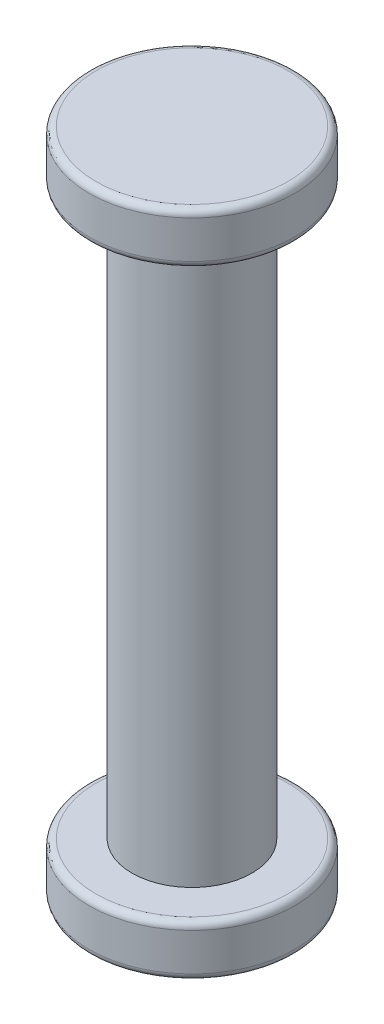
ISO-10303-21;
HEADER;
FILE_DESCRIPTION(('STEP AP214'),'2;1');
FILE_NAME('part.step','',(''),(''),'','','');
FILE_SCHEMA(('AUTOMOTIVE_DESIGN { 1 0 10303 214 1 1 1 1 }'));
ENDSEC;
DATA;
#1=APPLICATION_CONTEXT('core data for automotive mechanical design processes');
#2=APPLICATION_PROTOCOL_DEFINITION('international standard','automotive_design',2000,#1);
#3=PRODUCT_CONTEXT('',#1,'mechanical');
#4=PRODUCT('Part','Part','',(#3));
#5=PRODUCT_RELATED_PRODUCT_CATEGORY('part','',(#4));
#6=PRODUCT_DEFINITION_FORMATION('','',#4);
#7=PRODUCT_DEFINITION_CONTEXT('part definition',#1,'design');
#8=PRODUCT_DEFINITION('design','',#6,#7);
#9=PRODUCT_DEFINITION_SHAPE('','',#8);
#10=(LENGTH_UNIT() NAMED_UNIT(*) SI_UNIT(.MILLI.,.METRE.));
#11=(NAMED_UNIT(*) PLANE_ANGLE_UNIT() SI_UNIT($,.RADIAN.));
#12=(NAMED_UNIT(*) SI_UNIT($,.STERADIAN.) SOLID_ANGLE_UNIT());
#13=UNCERTAINTY_MEASURE_WITH_UNIT(LENGTH_MEASURE(1.E-05),#10,'distance_accuracy_value','');
#14=(GEOMETRIC_REPRESENTATION_CONTEXT(3) GLOBAL_UNCERTAINTY_ASSIGNED_CONTEXT((#13)) GLOBAL_UNIT_ASSIGNED_CONTEXT((#10,
#11,#12)) REPRESENTATION_CONTEXT('',''));
#15=CARTESIAN_POINT('',(0.,0.,0.));
#16=DIRECTION('',(0.,0.,1.));
#17=DIRECTION('',(1.,0.,0.));
#18=AXIS2_PLACEMENT_3D('',#15,#16,#17);
#19=CARTESIAN_POINT('',(0.,8.25,0.));
#20=DIRECTION('',(0.,-1.,0.));
#21=DIRECTION('',(0.,0.,-1.));
#22=AXIS2_PLACEMENT_3D('',#19,#20,#21);
#23=CYLINDRICAL_SURFACE('',#22,1.75);
#24=CARTESIAN_POINT('',(0.,8.25,0.));
#25=DIRECTION('',(0.,1.,0.));
#26=DIRECTION('',(0.,0.,1.));
#27=AXIS2_PLACEMENT_3D('',#24,#25,#26);
#28=CIRCLE('',#27,1.75);
#29=CARTESIAN_POINT('',(0.,8.25,1.75));
#30=VERTEX_POINT('',#29);
#31=EDGE_CURVE('E10',#30,#30,#28,.T.);
#32=ORIENTED_EDGE('',*,*,#31,.F.);
#33=EDGE_LOOP('',(#32));
#34=FACE_BOUND('',#33,.T.);
#35=CARTESIAN_POINT('',(0.,-8.25,0.));
#36=DIRECTION('',(0.,1.,0.));
#37=DIRECTION('',(0.,0.,1.));
#38=AXIS2_PLACEMENT_3D('',#35,#36,#37);
#39=CIRCLE('',#38,1.75);
#40=CARTESIAN_POINT('',(0.,-8.25,1.75));
#41=VERTEX_POINT('',#40);
#42=EDGE_CURVE('E72',#41,#41,#39,.T.);
#43=ORIENTED_EDGE('',*,*,#42,.T.);
#44=EDGE_LOOP('',(#43));
#45=FACE_BOUND('',#44,.T.);
#46=ADVANCED_FACE('F45',(#34,#45),#23,.T.);
#47=CARTESIAN_POINT('',(0.,9.55,0.));
#48=DIRECTION('',(0.,1.,0.));
#49=DIRECTION('',(0.,0.,1.));
#50=AXIS2_PLACEMENT_3D('',#47,#48,#49);
#51=TOROIDAL_SURFACE('',#50,2.8,0.2);
#52=CARTESIAN_POINT('',(0.,9.75,0.));
#53=DIRECTION('',(0.,1.,0.));
#54=DIRECTION('',(0.,0.,1.));
#55=AXIS2_PLACEMENT_3D('',#52,#53,#54);
#56=CIRCLE('',#55,2.8);
#57=CARTESIAN_POINT('',(0.,9.75,2.8));
#58=VERTEX_POINT('',#57);
#59=EDGE_CURVE('E68',#58,#58,#56,.T.);
#60=ORIENTED_EDGE('',*,*,#59,.F.);
#61=EDGE_LOOP('',(#60));
#62=FACE_BOUND('',#61,.T.);
#63=CARTESIAN_POINT('',(0.,9.55,0.));
#64=DIRECTION('',(0.,1.,0.));
#65=DIRECTION('',(0.,0.,1.));
#66=AXIS2_PLACEMENT_3D('',#63,#64,#65);
#67=CIRCLE('',#66,3.);
#68=CARTESIAN_POINT('',(0.,9.55,3.));
#69=VERTEX_POINT('',#68);
#70=EDGE_CURVE('E52',#69,#69,#67,.T.);
#71=ORIENTED_EDGE('',*,*,#70,.T.);
#72=EDGE_LOOP('',(#71));
#73=FACE_BOUND('',#72,.T.);
#74=ADVANCED_FACE('F114',(#62,#73),#51,.T.);
#75=CARTESIAN_POINT('',(0.,9.75,0.));
#76=DIRECTION('',(0.,1.,0.));
#77=DIRECTION('',(0.,0.,1.));
#78=AXIS2_PLACEMENT_3D('',#75,#76,#77);
#79=CYLINDRICAL_SURFACE('',#78,3.);
#80=ORIENTED_EDGE('',*,*,#70,.F.);
#81=EDGE_LOOP('',(#80));
#82=FACE_BOUND('',#81,.T.);
#83=CARTESIAN_POINT('',(0.,8.45,0.));
#84=DIRECTION('',(0.,1.,0.));
#85=DIRECTION('',(0.,0.,1.));
#86=AXIS2_PLACEMENT_3D('',#83,#84,#85);
#87=CIRCLE('',#86,3.);
#88=CARTESIAN_POINT('',(0.,8.45,3.));
#89=VERTEX_POINT('',#88);
#90=EDGE_CURVE('E57',#89,#89,#87,.T.);
#91=ORIENTED_EDGE('',*,*,#90,.T.);
#92=EDGE_LOOP('',(#91));
#93=FACE_BOUND('',#92,.T.);
#94=ADVANCED_FACE('F119',(#82,#93),#79,.T.);
#95=CARTESIAN_POINT('',(0.,8.45,0.));
#96=DIRECTION('',(0.,1.,0.));
#97=DIRECTION('',(0.,0.,1.));
#98=AXIS2_PLACEMENT_3D('',#95,#96,#97);
#99=TOROIDAL_SURFACE('',#98,2.8,0.2);
#100=CARTESIAN_POINT('',(0.,8.25,0.));
#101=DIRECTION('',(0.,1.,0.));
#102=DIRECTION('',(0.,0.,1.));
#103=AXIS2_PLACEMENT_3D('',#100,#101,#102);
#104=CIRCLE('',#103,2.8);
#105=CARTESIAN_POINT('',(0.,8.25,2.8));
#106=VERTEX_POINT('',#105);
#107=EDGE_CURVE('E62',#106,#106,#104,.T.);
#108=ORIENTED_EDGE('',*,*,#107,.T.);
#109=EDGE_LOOP('',(#108));
#110=FACE_BOUND('',#109,.T.);
#111=ORIENTED_EDGE('',*,*,#90,.F.);
#112=EDGE_LOOP('',(#111));
#113=FACE_BOUND('',#112,.T.);
#114=ADVANCED_FACE('F169',(#110,#113),#99,.T.);
#115=CARTESIAN_POINT('',(0.,8.25,0.));
#116=DIRECTION('',(0.,1.,0.));
#117=DIRECTION('',(0.,0.,1.));
#118=AXIS2_PLACEMENT_3D('',#115,#116,#117);
#119=PLANE('',#118);
#120=ORIENTED_EDGE('',*,*,#31,.T.);
#121=EDGE_LOOP('',(#120));
#122=FACE_BOUND('',#121,.T.);
#123=ORIENTED_EDGE('',*,*,#107,.F.);
#124=EDGE_LOOP('',(#123));
#125=FACE_BOUND('',#124,.T.);
#126=ADVANCED_FACE('F159',(#122,#125),#119,.F.);
#127=CARTESIAN_POINT('',(0.,9.75,0.));
#128=DIRECTION('',(0.,-1.,0.));
#129=DIRECTION('',(0.,0.,-1.));
#130=AXIS2_PLACEMENT_3D('',#127,#128,#129);
#131=PLANE('',#130);
#132=ORIENTED_EDGE('',*,*,#59,.T.);
#133=EDGE_LOOP('',(#132));
#134=FACE_BOUND('',#133,.T.);
#135=ADVANCED_FACE('F99',(#134),#131,.F.);
#136=CARTESIAN_POINT('',(0.,-8.45,0.));
#137=DIRECTION('',(0.,1.,0.));
#138=DIRECTION('',(0.,0.,1.));
#139=AXIS2_PLACEMENT_3D('',#136,#137,#138);
#140=TOROIDAL_SURFACE('',#139,2.8,0.2);
#141=CARTESIAN_POINT('',(0.,-8.25,0.));
#142=DIRECTION('',(0.,1.,0.));
#143=DIRECTION('',(0.,0.,1.));
#144=AXIS2_PLACEMENT_3D('',#141,#142,#143);
#145=CIRCLE('',#144,2.8);
#146=CARTESIAN_POINT('',(0.,-8.25,2.8));
#147=VERTEX_POINT('',#146);
#148=EDGE_CURVE('E88',#147,#147,#145,.T.);
#149=ORIENTED_EDGE('',*,*,#148,.F.);
#150=EDGE_LOOP('',(#149));
#151=FACE_BOUND('',#150,.T.);
#152=CARTESIAN_POINT('',(0.,-8.45,0.));
#153=DIRECTION('',(0.,1.,0.));
#154=DIRECTION('',(0.,0.,1.));
#155=AXIS2_PLACEMENT_3D('',#152,#153,#154);
#156=CIRCLE('',#155,3.);
#157=CARTESIAN_POINT('',(0.,-8.45,3.));
#158=VERTEX_POINT('',#157);
#159=EDGE_CURVE('E76',#158,#158,#156,.T.);
#160=ORIENTED_EDGE('',*,*,#159,.T.);
#161=EDGE_LOOP('',(#160));
#162=FACE_BOUND('',#161,.T.);
#163=ADVANCED_FACE('F95',(#151,#162),#140,.T.);
#164=CARTESIAN_POINT('',(0.,9.75,0.));
#165=DIRECTION('',(0.,1.,0.));
#166=DIRECTION('',(0.,0.,1.));
#167=AXIS2_PLACEMENT_3D('',#164,#165,#166);
#168=CYLINDRICAL_SURFACE('',#167,3.);
#169=CARTESIAN_POINT('',(0.,-9.55,0.));
#170=DIRECTION('',(0.,1.,0.));
#171=DIRECTION('',(0.,0.,1.));
#172=AXIS2_PLACEMENT_3D('',#169,#170,#171);
#173=CIRCLE('',#172,3.);
#174=CARTESIAN_POINT('',(0.,-9.55,3.));
#175=VERTEX_POINT('',#174);
#176=EDGE_CURVE('E80',#175,#175,#173,.T.);
#177=ORIENTED_EDGE('',*,*,#176,.T.);
#178=EDGE_LOOP('',(#177));
#179=FACE_BOUND('',#178,.T.);
#180=ORIENTED_EDGE('',*,*,#159,.F.);
#181=EDGE_LOOP('',(#180));
#182=FACE_BOUND('',#181,.T.);
#183=ADVANCED_FACE('F98',(#179,#182),#168,.T.);
#184=CARTESIAN_POINT('',(0.,-9.55,0.));
#185=DIRECTION('',(0.,1.,0.));
#186=DIRECTION('',(0.,0.,1.));
#187=AXIS2_PLACEMENT_3D('',#184,#185,#186);
#188=TOROIDAL_SURFACE('',#187,2.8,0.2);
#189=CARTESIAN_POINT('',(0.,-9.75,0.));
#190=DIRECTION('',(0.,1.,0.));
#191=DIRECTION('',(0.,0.,1.));
#192=AXIS2_PLACEMENT_3D('',#189,#190,#191);
#193=CIRCLE('',#192,2.8);
#194=CARTESIAN_POINT('',(0.,-9.75,2.8));
#195=VERTEX_POINT('',#194);
#196=EDGE_CURVE('E84',#195,#195,#193,.T.);
#197=ORIENTED_EDGE('',*,*,#196,.T.);
#198=EDGE_LOOP('',(#197));
#199=FACE_BOUND('',#198,.T.);
#200=ORIENTED_EDGE('',*,*,#176,.F.);
#201=EDGE_LOOP('',(#200));
#202=FACE_BOUND('',#201,.T.);
#203=ADVANCED_FACE('F104',(#199,#202),#188,.T.);
#204=CARTESIAN_POINT('',(0.,-9.75,0.));
#205=DIRECTION('',(0.,-1.,0.));
#206=DIRECTION('',(0.,0.,-1.));
#207=AXIS2_PLACEMENT_3D('',#204,#205,#206);
#208=PLANE('',#207);
#209=ORIENTED_EDGE('',*,*,#196,.F.);
#210=EDGE_LOOP('',(#209));
#211=FACE_BOUND('',#210,.T.);
#212=ADVANCED_FACE('F110',(#211),#208,.T.);
#213=CARTESIAN_POINT('',(0.,-8.25,0.));
#214=DIRECTION('',(0.,1.,0.));
#215=DIRECTION('',(0.,0.,1.));
#216=AXIS2_PLACEMENT_3D('',#213,#214,#215);
#217=PLANE('',#216);
#218=ORIENTED_EDGE('',*,*,#42,.F.);
#219=EDGE_LOOP('',(#218));
#220=FACE_BOUND('',#219,.T.);
#221=ORIENTED_EDGE('',*,*,#148,.T.);
#222=EDGE_LOOP('',(#221));
#223=FACE_BOUND('',#222,.T.);
#224=ADVANCED_FACE('F93',(#220,#223),#217,.T.);
#225=CLOSED_SHELL('',(#46,#74,#94,#114,#126,#135,#163,#183,#203,#212,#224));
#226=MANIFOLD_SOLID_BREP('B2',#225);
#227=ADVANCED_BREP_SHAPE_REPRESENTATION('',(#18,#226),#14);
#228=SHAPE_DEFINITION_REPRESENTATION(#9,#227);
ENDSEC;
END-ISO-10303-21;
